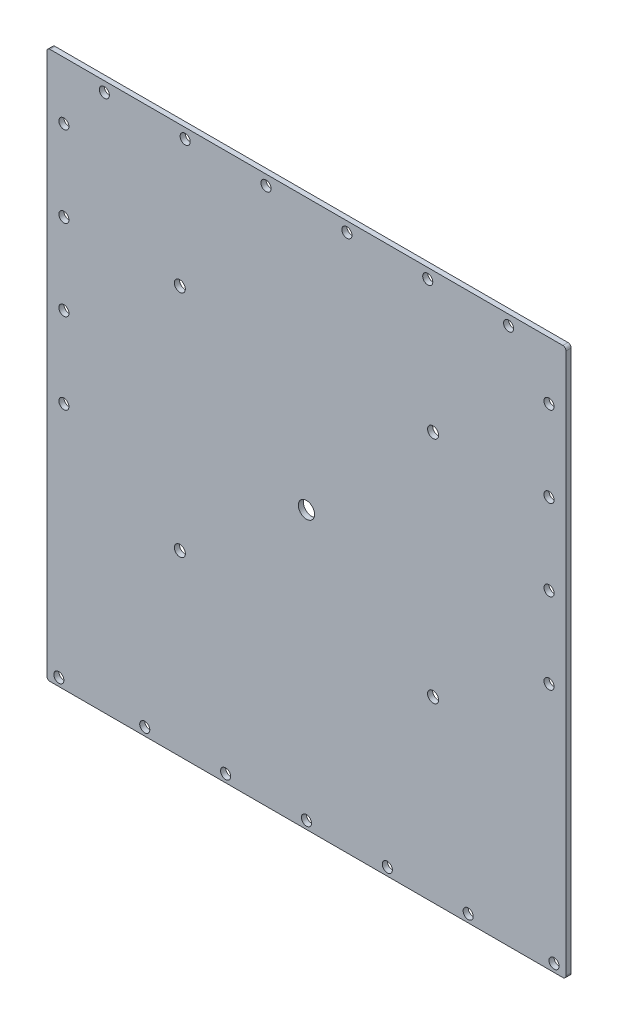
ISO-10303-21;
HEADER;
FILE_DESCRIPTION(('STEP AP214'),'2;1');
FILE_NAME('part.step','',(''),(''),'','','');
FILE_SCHEMA(('AUTOMOTIVE_DESIGN { 1 0 10303 214 1 1 1 1 }'));
ENDSEC;
DATA;
#1=APPLICATION_CONTEXT('core data for automotive mechanical design processes');
#2=APPLICATION_PROTOCOL_DEFINITION('international standard','automotive_design',2000,#1);
#3=PRODUCT_CONTEXT('',#1,'mechanical');
#4=PRODUCT('Part','Part','',(#3));
#5=PRODUCT_RELATED_PRODUCT_CATEGORY('part','',(#4));
#6=PRODUCT_DEFINITION_FORMATION('','',#4);
#7=PRODUCT_DEFINITION_CONTEXT('part definition',#1,'design');
#8=PRODUCT_DEFINITION('design','',#6,#7);
#9=PRODUCT_DEFINITION_SHAPE('','',#8);
#10=(LENGTH_UNIT() NAMED_UNIT(*) SI_UNIT(.MILLI.,.METRE.));
#11=(NAMED_UNIT(*) PLANE_ANGLE_UNIT() SI_UNIT($,.RADIAN.));
#12=(NAMED_UNIT(*) SI_UNIT($,.STERADIAN.) SOLID_ANGLE_UNIT());
#13=UNCERTAINTY_MEASURE_WITH_UNIT(LENGTH_MEASURE(1.E-05),#10,'distance_accuracy_value','');
#14=(GEOMETRIC_REPRESENTATION_CONTEXT(3) GLOBAL_UNCERTAINTY_ASSIGNED_CONTEXT((#13)) GLOBAL_UNIT_ASSIGNED_CONTEXT((#10,
#11,#12)) REPRESENTATION_CONTEXT('',''));
#15=CARTESIAN_POINT('',(0.,0.,0.));
#16=DIRECTION('',(0.,0.,1.));
#17=DIRECTION('',(1.,0.,0.));
#18=AXIS2_PLACEMENT_3D('',#15,#16,#17);
#19=CARTESIAN_POINT('',(0.,-171.98,1.6));
#20=DIRECTION('',(0.,1.,0.));
#21=DIRECTION('',(-1.,0.,0.));
#22=AXIS2_PLACEMENT_3D('',#19,#20,#21);
#23=PLANE('',#22);
#24=DIRECTION('',(1.,0.,0.));
#25=VECTOR('',#24,1.);
#26=CARTESIAN_POINT('',(0.,-171.98,1.6));
#27=LINE('',#26,#25);
#28=CARTESIAN_POINT('',(2.00000000000002,-171.98,1.6));
#29=VERTEX_POINT('',#28);
#30=CARTESIAN_POINT('',(163.1,-171.98,1.6));
#31=VERTEX_POINT('',#30);
#32=EDGE_CURVE('E132',#29,#31,#27,.T.);
#33=ORIENTED_EDGE('',*,*,#32,.F.);
#34=DIRECTION('',(0.,0.,-1.));
#35=VECTOR('',#34,1.);
#36=CARTESIAN_POINT('',(2.00000000000002,-171.98,1.6));
#37=LINE('',#36,#35);
#38=CARTESIAN_POINT('',(2.00000000000002,-171.98,0.));
#39=VERTEX_POINT('',#38);
#40=EDGE_CURVE('E116',#29,#39,#37,.T.);
#41=ORIENTED_EDGE('',*,*,#40,.T.);
#42=DIRECTION('',(1.,0.,0.));
#43=VECTOR('',#42,1.);
#44=CARTESIAN_POINT('',(0.,-171.98,0.));
#45=LINE('',#44,#43);
#46=CARTESIAN_POINT('',(163.1,-171.98,0.));
#47=VERTEX_POINT('',#46);
#48=EDGE_CURVE('E129',#39,#47,#45,.T.);
#49=ORIENTED_EDGE('',*,*,#48,.T.);
#50=DIRECTION('',(0.,0.,-1.));
#51=VECTOR('',#50,1.);
#52=CARTESIAN_POINT('',(163.1,-171.98,1.6));
#53=LINE('',#52,#51);
#54=EDGE_CURVE('E135',#47,#31,#53,.F.);
#55=ORIENTED_EDGE('',*,*,#54,.T.);
#56=EDGE_LOOP('',(#33,#41,#49,#55));
#57=FACE_BOUND('',#56,.T.);
#58=ADVANCED_FACE('F45',(#57),#23,.F.);
#59=CARTESIAN_POINT('',(164.1,0.,1.6));
#60=DIRECTION('',(-1.,0.,0.));
#61=DIRECTION('',(0.,0.,1.));
#62=AXIS2_PLACEMENT_3D('',#59,#60,#61);
#63=PLANE('',#62);
#64=DIRECTION('',(0.,1.,0.));
#65=VECTOR('',#64,1.);
#66=CARTESIAN_POINT('',(164.1,0.,0.));
#67=LINE('',#66,#65);
#68=CARTESIAN_POINT('',(164.1,-170.98,0.));
#69=VERTEX_POINT('',#68);
#70=CARTESIAN_POINT('',(164.1,-0.99999999999998,0.));
#71=VERTEX_POINT('',#70);
#72=EDGE_CURVE('E141',#69,#71,#67,.T.);
#73=ORIENTED_EDGE('',*,*,#72,.T.);
#74=DIRECTION('',(0.,0.,-1.));
#75=VECTOR('',#74,1.);
#76=CARTESIAN_POINT('',(164.1,-0.99999999999998,1.6));
#77=LINE('',#76,#75);
#78=CARTESIAN_POINT('',(164.1,-0.99999999999998,1.6));
#79=VERTEX_POINT('',#78);
#80=EDGE_CURVE('E11',#71,#79,#77,.F.);
#81=ORIENTED_EDGE('',*,*,#80,.T.);
#82=DIRECTION('',(0.,1.,0.));
#83=VECTOR('',#82,1.);
#84=CARTESIAN_POINT('',(164.1,0.,1.6));
#85=LINE('',#84,#83);
#86=CARTESIAN_POINT('',(164.1,-170.98,1.6));
#87=VERTEX_POINT('',#86);
#88=EDGE_CURVE('E283',#87,#79,#85,.T.);
#89=ORIENTED_EDGE('',*,*,#88,.F.);
#90=DIRECTION('',(0.,0.,-1.));
#91=VECTOR('',#90,1.);
#92=CARTESIAN_POINT('',(164.1,-170.98,1.6));
#93=LINE('',#92,#91);
#94=EDGE_CURVE('E54',#87,#69,#93,.T.);
#95=ORIENTED_EDGE('',*,*,#94,.T.);
#96=EDGE_LOOP('',(#73,#81,#89,#95));
#97=FACE_BOUND('',#96,.T.);
#98=ADVANCED_FACE('F281',(#97),#63,.F.);
#99=CARTESIAN_POINT('',(0.,0.,1.6));
#100=DIRECTION('',(0.,1.,0.));
#101=DIRECTION('',(-1.,0.,0.));
#102=AXIS2_PLACEMENT_3D('',#99,#100,#101);
#103=PLANE('',#102);
#104=DIRECTION('',(1.,0.,0.));
#105=VECTOR('',#104,1.);
#106=CARTESIAN_POINT('',(0.,0.,0.));
#107=LINE('',#106,#105);
#108=CARTESIAN_POINT('',(2.,0.,0.));
#109=VERTEX_POINT('',#108);
#110=CARTESIAN_POINT('',(163.1,0.,0.));
#111=VERTEX_POINT('',#110);
#112=EDGE_CURVE('E147',#109,#111,#107,.T.);
#113=ORIENTED_EDGE('',*,*,#112,.F.);
#114=DIRECTION('',(0.,0.,-1.));
#115=VECTOR('',#114,1.);
#116=CARTESIAN_POINT('',(2.,0.,1.6));
#117=LINE('',#116,#115);
#118=CARTESIAN_POINT('',(2.,0.,1.6));
#119=VERTEX_POINT('',#118);
#120=EDGE_CURVE('E68',#109,#119,#117,.F.);
#121=ORIENTED_EDGE('',*,*,#120,.T.);
#122=DIRECTION('',(1.,0.,0.));
#123=VECTOR('',#122,1.);
#124=CARTESIAN_POINT('',(0.,0.,1.6));
#125=LINE('',#124,#123);
#126=CARTESIAN_POINT('',(163.1,0.,1.6));
#127=VERTEX_POINT('',#126);
#128=EDGE_CURVE('E290',#119,#127,#125,.T.);
#129=ORIENTED_EDGE('',*,*,#128,.T.);
#130=DIRECTION('',(0.,0.,-1.));
#131=VECTOR('',#130,1.);
#132=CARTESIAN_POINT('',(163.1,0.,0.));
#133=LINE('',#132,#131);
#134=EDGE_CURVE('E271',#127,#111,#133,.T.);
#135=ORIENTED_EDGE('',*,*,#134,.T.);
#136=EDGE_LOOP('',(#113,#121,#129,#135));
#137=FACE_BOUND('',#136,.T.);
#138=ADVANCED_FACE('F289',(#137),#103,.T.);
#139=CARTESIAN_POINT('',(158.75,-68.85,1.6));
#140=DIRECTION('',(0.,0.,-1.));
#141=DIRECTION('',(-1.,0.,0.));
#142=AXIS2_PLACEMENT_3D('',#139,#140,#141);
#143=CYLINDRICAL_SURFACE('',#142,1.58749999999999);
#144=CARTESIAN_POINT('',(158.75,-68.85,1.6));
#145=DIRECTION('',(0.,0.,1.));
#146=DIRECTION('',(1.,0.,0.));
#147=AXIS2_PLACEMENT_3D('',#144,#145,#146);
#148=CIRCLE('',#147,1.58749999999999);
#149=CARTESIAN_POINT('',(160.3375,-68.85,1.6));
#150=VERTEX_POINT('',#149);
#151=EDGE_CURVE('E378',#150,#150,#148,.F.);
#152=ORIENTED_EDGE('',*,*,#151,.F.);
#153=EDGE_LOOP('',(#152));
#154=FACE_BOUND('',#153,.T.);
#155=CARTESIAN_POINT('',(158.75,-68.85,0.));
#156=DIRECTION('',(0.,0.,1.));
#157=DIRECTION('',(1.,0.,0.));
#158=AXIS2_PLACEMENT_3D('',#155,#156,#157);
#159=CIRCLE('',#158,1.58749999999999);
#160=CARTESIAN_POINT('',(160.3375,-68.85,0.));
#161=VERTEX_POINT('',#160);
#162=EDGE_CURVE('E236',#161,#161,#159,.F.);
#163=ORIENTED_EDGE('',*,*,#162,.T.);
#164=EDGE_LOOP('',(#163));
#165=FACE_BOUND('',#164,.T.);
#166=ADVANCED_FACE('F580',(#154,#165),#143,.F.);
#167=CARTESIAN_POINT('',(120.65,-3.17499999999999,1.6));
#168=DIRECTION('',(0.,0.,-1.));
#169=DIRECTION('',(-1.,0.,0.));
#170=AXIS2_PLACEMENT_3D('',#167,#168,#169);
#171=CYLINDRICAL_SURFACE('',#170,1.5875);
#172=CARTESIAN_POINT('',(120.65,-3.17499999999999,1.6));
#173=DIRECTION('',(0.,0.,1.));
#174=DIRECTION('',(1.,0.,0.));
#175=AXIS2_PLACEMENT_3D('',#172,#173,#174);
#176=CIRCLE('',#175,1.5875);
#177=CARTESIAN_POINT('',(122.2375,-3.17499999999999,1.6));
#178=VERTEX_POINT('',#177);
#179=EDGE_CURVE('E374',#178,#178,#176,.F.);
#180=ORIENTED_EDGE('',*,*,#179,.F.);
#181=EDGE_LOOP('',(#180));
#182=FACE_BOUND('',#181,.T.);
#183=CARTESIAN_POINT('',(120.65,-3.17499999999999,0.));
#184=DIRECTION('',(0.,0.,1.));
#185=DIRECTION('',(1.,0.,0.));
#186=AXIS2_PLACEMENT_3D('',#183,#184,#185);
#187=CIRCLE('',#186,1.5875);
#188=CARTESIAN_POINT('',(122.2375,-3.17499999999999,0.));
#189=VERTEX_POINT('',#188);
#190=EDGE_CURVE('E232',#189,#189,#187,.F.);
#191=ORIENTED_EDGE('',*,*,#190,.T.);
#192=EDGE_LOOP('',(#191));
#193=FACE_BOUND('',#192,.T.);
#194=ADVANCED_FACE('F801',(#182,#193),#171,.F.);
#195=CARTESIAN_POINT('',(160.3375,-169.48,1.6));
#196=DIRECTION('',(0.,0.,-1.));
#197=DIRECTION('',(-1.,0.,0.));
#198=AXIS2_PLACEMENT_3D('',#195,#196,#197);
#199=CYLINDRICAL_SURFACE('',#198,1.58749999999999);
#200=CARTESIAN_POINT('',(160.3375,-169.48,1.6));
#201=DIRECTION('',(0.,0.,1.));
#202=DIRECTION('',(1.,0.,0.));
#203=AXIS2_PLACEMENT_3D('',#200,#201,#202);
#204=CIRCLE('',#203,1.58749999999999);
#205=CARTESIAN_POINT('',(161.925,-169.48,1.6));
#206=VERTEX_POINT('',#205);
#207=EDGE_CURVE('E370',#206,#206,#204,.T.);
#208=ORIENTED_EDGE('',*,*,#207,.T.);
#209=EDGE_LOOP('',(#208));
#210=FACE_BOUND('',#209,.T.);
#211=CARTESIAN_POINT('',(160.3375,-169.48,0.));
#212=DIRECTION('',(0.,0.,1.));
#213=DIRECTION('',(1.,0.,0.));
#214=AXIS2_PLACEMENT_3D('',#211,#212,#213);
#215=CIRCLE('',#214,1.58749999999999);
#216=CARTESIAN_POINT('',(161.925,-169.48,0.));
#217=VERTEX_POINT('',#216);
#218=EDGE_CURVE('E228',#217,#217,#215,.T.);
#219=ORIENTED_EDGE('',*,*,#218,.F.);
#220=EDGE_LOOP('',(#219));
#221=FACE_BOUND('',#220,.T.);
#222=ADVANCED_FACE('F790',(#210,#221),#199,.F.);
#223=CARTESIAN_POINT('',(133.35,-169.48,1.6));
#224=DIRECTION('',(0.,0.,-1.));
#225=DIRECTION('',(-1.,0.,0.));
#226=AXIS2_PLACEMENT_3D('',#223,#224,#225);
#227=CYLINDRICAL_SURFACE('',#226,1.58749999999999);
#228=CARTESIAN_POINT('',(133.35,-169.48,1.6));
#229=DIRECTION('',(0.,0.,1.));
#230=DIRECTION('',(1.,0.,0.));
#231=AXIS2_PLACEMENT_3D('',#228,#229,#230);
#232=CIRCLE('',#231,1.58749999999999);
#233=CARTESIAN_POINT('',(134.9375,-169.48,1.6));
#234=VERTEX_POINT('',#233);
#235=EDGE_CURVE('E366',#234,#234,#232,.T.);
#236=ORIENTED_EDGE('',*,*,#235,.T.);
#237=EDGE_LOOP('',(#236));
#238=FACE_BOUND('',#237,.T.);
#239=CARTESIAN_POINT('',(133.35,-169.48,0.));
#240=DIRECTION('',(0.,0.,1.));
#241=DIRECTION('',(1.,0.,0.));
#242=AXIS2_PLACEMENT_3D('',#239,#240,#241);
#243=CIRCLE('',#242,1.58749999999999);
#244=CARTESIAN_POINT('',(134.9375,-169.48,0.));
#245=VERTEX_POINT('',#244);
#246=EDGE_CURVE('E224',#245,#245,#243,.T.);
#247=ORIENTED_EDGE('',*,*,#246,.F.);
#248=EDGE_LOOP('',(#247));
#249=FACE_BOUND('',#248,.T.);
#250=ADVANCED_FACE('F779',(#238,#249),#227,.F.);
#251=CARTESIAN_POINT('',(107.95,-169.48,1.6));
#252=DIRECTION('',(0.,0.,-1.));
#253=DIRECTION('',(-1.,0.,0.));
#254=AXIS2_PLACEMENT_3D('',#251,#252,#253);
#255=CYLINDRICAL_SURFACE('',#254,1.58749999999999);
#256=CARTESIAN_POINT('',(107.95,-169.48,1.6));
#257=DIRECTION('',(0.,0.,1.));
#258=DIRECTION('',(1.,0.,0.));
#259=AXIS2_PLACEMENT_3D('',#256,#257,#258);
#260=CIRCLE('',#259,1.58749999999999);
#261=CARTESIAN_POINT('',(109.5375,-169.48,1.6));
#262=VERTEX_POINT('',#261);
#263=EDGE_CURVE('E362',#262,#262,#260,.T.);
#264=ORIENTED_EDGE('',*,*,#263,.T.);
#265=EDGE_LOOP('',(#264));
#266=FACE_BOUND('',#265,.T.);
#267=CARTESIAN_POINT('',(107.95,-169.48,0.));
#268=DIRECTION('',(0.,0.,1.));
#269=DIRECTION('',(1.,0.,0.));
#270=AXIS2_PLACEMENT_3D('',#267,#268,#269);
#271=CIRCLE('',#270,1.58749999999999);
#272=CARTESIAN_POINT('',(109.5375,-169.48,0.));
#273=VERTEX_POINT('',#272);
#274=EDGE_CURVE('E220',#273,#273,#271,.T.);
#275=ORIENTED_EDGE('',*,*,#274,.F.);
#276=EDGE_LOOP('',(#275));
#277=FACE_BOUND('',#276,.T.);
#278=ADVANCED_FACE('F768',(#266,#277),#255,.F.);
#279=CARTESIAN_POINT('',(95.25,-3.175,1.6));
#280=DIRECTION('',(0.,0.,-1.));
#281=DIRECTION('',(-1.,0.,0.));
#282=AXIS2_PLACEMENT_3D('',#279,#280,#281);
#283=CYLINDRICAL_SURFACE('',#282,1.5875);
#284=CARTESIAN_POINT('',(95.25,-3.175,1.6));
#285=DIRECTION('',(0.,0.,1.));
#286=DIRECTION('',(1.,0.,0.));
#287=AXIS2_PLACEMENT_3D('',#284,#285,#286);
#288=CIRCLE('',#287,1.5875);
#289=CARTESIAN_POINT('',(96.8375,-3.175,1.6));
#290=VERTEX_POINT('',#289);
#291=EDGE_CURVE('E358',#290,#290,#288,.F.);
#292=ORIENTED_EDGE('',*,*,#291,.F.);
#293=EDGE_LOOP('',(#292));
#294=FACE_BOUND('',#293,.T.);
#295=CARTESIAN_POINT('',(95.25,-3.175,0.));
#296=DIRECTION('',(0.,0.,1.));
#297=DIRECTION('',(1.,0.,0.));
#298=AXIS2_PLACEMENT_3D('',#295,#296,#297);
#299=CIRCLE('',#298,1.5875);
#300=CARTESIAN_POINT('',(96.8375,-3.175,0.));
#301=VERTEX_POINT('',#300);
#302=EDGE_CURVE('E216',#301,#301,#299,.F.);
#303=ORIENTED_EDGE('',*,*,#302,.T.);
#304=EDGE_LOOP('',(#303));
#305=FACE_BOUND('',#304,.T.);
#306=ADVANCED_FACE('F757',(#294,#305),#283,.F.);
#307=CARTESIAN_POINT('',(146.05,-3.17499999999998,1.6));
#308=DIRECTION('',(0.,0.,-1.));
#309=DIRECTION('',(-1.,0.,0.));
#310=AXIS2_PLACEMENT_3D('',#307,#308,#309);
#311=CYLINDRICAL_SURFACE('',#310,1.58749999999999);
#312=CARTESIAN_POINT('',(146.05,-3.17499999999998,1.6));
#313=DIRECTION('',(0.,0.,1.));
#314=DIRECTION('',(1.,0.,0.));
#315=AXIS2_PLACEMENT_3D('',#312,#313,#314);
#316=CIRCLE('',#315,1.58749999999999);
#317=CARTESIAN_POINT('',(147.6375,-3.17499999999998,1.6));
#318=VERTEX_POINT('',#317);
#319=EDGE_CURVE('E354',#318,#318,#316,.F.);
#320=ORIENTED_EDGE('',*,*,#319,.F.);
#321=EDGE_LOOP('',(#320));
#322=FACE_BOUND('',#321,.T.);
#323=CARTESIAN_POINT('',(146.05,-3.17499999999998,0.));
#324=DIRECTION('',(0.,0.,1.));
#325=DIRECTION('',(1.,0.,0.));
#326=AXIS2_PLACEMENT_3D('',#323,#324,#325);
#327=CIRCLE('',#326,1.58749999999999);
#328=CARTESIAN_POINT('',(147.6375,-3.17499999999998,0.));
#329=VERTEX_POINT('',#328);
#330=EDGE_CURVE('E212',#329,#329,#327,.F.);
#331=ORIENTED_EDGE('',*,*,#330,.T.);
#332=EDGE_LOOP('',(#331));
#333=FACE_BOUND('',#332,.T.);
#334=ADVANCED_FACE('F746',(#322,#333),#311,.F.);
#335=CARTESIAN_POINT('',(158.75,-94.25,1.6));
#336=DIRECTION('',(0.,0.,-1.));
#337=DIRECTION('',(-1.,0.,0.));
#338=AXIS2_PLACEMENT_3D('',#335,#336,#337);
#339=CYLINDRICAL_SURFACE('',#338,1.58749999999999);
#340=CARTESIAN_POINT('',(158.75,-94.25,1.6));
#341=DIRECTION('',(0.,0.,1.));
#342=DIRECTION('',(1.,0.,0.));
#343=AXIS2_PLACEMENT_3D('',#340,#341,#342);
#344=CIRCLE('',#343,1.58749999999999);
#345=CARTESIAN_POINT('',(160.3375,-94.25,1.6));
#346=VERTEX_POINT('',#345);
#347=EDGE_CURVE('E350',#346,#346,#344,.F.);
#348=ORIENTED_EDGE('',*,*,#347,.F.);
#349=EDGE_LOOP('',(#348));
#350=FACE_BOUND('',#349,.T.);
#351=CARTESIAN_POINT('',(158.75,-94.25,0.));
#352=DIRECTION('',(0.,0.,1.));
#353=DIRECTION('',(1.,0.,0.));
#354=AXIS2_PLACEMENT_3D('',#351,#352,#353);
#355=CIRCLE('',#354,1.58749999999999);
#356=CARTESIAN_POINT('',(160.3375,-94.25,0.));
#357=VERTEX_POINT('',#356);
#358=EDGE_CURVE('E208',#357,#357,#355,.F.);
#359=ORIENTED_EDGE('',*,*,#358,.T.);
#360=EDGE_LOOP('',(#359));
#361=FACE_BOUND('',#360,.T.);
#362=ADVANCED_FACE('F735',(#350,#361),#339,.F.);
#363=CARTESIAN_POINT('',(158.750000000001,-18.05,1.6));
#364=DIRECTION('',(0.,0.,-1.));
#365=DIRECTION('',(-1.,0.,0.));
#366=AXIS2_PLACEMENT_3D('',#363,#364,#365);
#367=CYLINDRICAL_SURFACE('',#366,1.58749999999999);
#368=CARTESIAN_POINT('',(158.750000000001,-18.05,1.6));
#369=DIRECTION('',(0.,0.,1.));
#370=DIRECTION('',(1.,0.,0.));
#371=AXIS2_PLACEMENT_3D('',#368,#369,#370);
#372=CIRCLE('',#371,1.58749999999999);
#373=CARTESIAN_POINT('',(160.3375,-18.05,1.6));
#374=VERTEX_POINT('',#373);
#375=EDGE_CURVE('E346',#374,#374,#372,.F.);
#376=ORIENTED_EDGE('',*,*,#375,.F.);
#377=EDGE_LOOP('',(#376));
#378=FACE_BOUND('',#377,.T.);
#379=CARTESIAN_POINT('',(158.750000000001,-18.05,0.));
#380=DIRECTION('',(0.,0.,1.));
#381=DIRECTION('',(1.,0.,0.));
#382=AXIS2_PLACEMENT_3D('',#379,#380,#381);
#383=CIRCLE('',#382,1.58749999999999);
#384=CARTESIAN_POINT('',(160.3375,-18.05,0.));
#385=VERTEX_POINT('',#384);
#386=EDGE_CURVE('E204',#385,#385,#383,.F.);
#387=ORIENTED_EDGE('',*,*,#386,.T.);
#388=EDGE_LOOP('',(#387));
#389=FACE_BOUND('',#388,.T.);
#390=ADVANCED_FACE('F724',(#378,#389),#367,.F.);
#391=CARTESIAN_POINT('',(69.85,-3.175,1.6));
#392=DIRECTION('',(0.,0.,-1.));
#393=DIRECTION('',(-1.,0.,0.));
#394=AXIS2_PLACEMENT_3D('',#391,#392,#393);
#395=CYLINDRICAL_SURFACE('',#394,1.5875);
#396=CARTESIAN_POINT('',(69.85,-3.175,1.6));
#397=DIRECTION('',(0.,0.,1.));
#398=DIRECTION('',(1.,0.,0.));
#399=AXIS2_PLACEMENT_3D('',#396,#397,#398);
#400=CIRCLE('',#399,1.5875);
#401=CARTESIAN_POINT('',(71.4375,-3.175,1.6));
#402=VERTEX_POINT('',#401);
#403=EDGE_CURVE('E342',#402,#402,#400,.T.);
#404=ORIENTED_EDGE('',*,*,#403,.T.);
#405=EDGE_LOOP('',(#404));
#406=FACE_BOUND('',#405,.T.);
#407=CARTESIAN_POINT('',(69.85,-3.175,0.));
#408=DIRECTION('',(0.,0.,1.));
#409=DIRECTION('',(1.,0.,0.));
#410=AXIS2_PLACEMENT_3D('',#407,#408,#409);
#411=CIRCLE('',#410,1.5875);
#412=CARTESIAN_POINT('',(71.4375,-3.175,0.));
#413=VERTEX_POINT('',#412);
#414=EDGE_CURVE('E200',#413,#413,#411,.T.);
#415=ORIENTED_EDGE('',*,*,#414,.F.);
#416=EDGE_LOOP('',(#415));
#417=FACE_BOUND('',#416,.T.);
#418=ADVANCED_FACE('F713',(#406,#417),#395,.F.);
#419=CARTESIAN_POINT('',(44.45,-3.175,1.6));
#420=DIRECTION('',(0.,0.,-1.));
#421=DIRECTION('',(-1.,0.,0.));
#422=AXIS2_PLACEMENT_3D('',#419,#420,#421);
#423=CYLINDRICAL_SURFACE('',#422,1.5875);
#424=CARTESIAN_POINT('',(44.45,-3.175,1.6));
#425=DIRECTION('',(0.,0.,1.));
#426=DIRECTION('',(1.,0.,0.));
#427=AXIS2_PLACEMENT_3D('',#424,#425,#426);
#428=CIRCLE('',#427,1.5875);
#429=CARTESIAN_POINT('',(46.0375,-3.175,1.6));
#430=VERTEX_POINT('',#429);
#431=EDGE_CURVE('E338',#430,#430,#428,.T.);
#432=ORIENTED_EDGE('',*,*,#431,.T.);
#433=EDGE_LOOP('',(#432));
#434=FACE_BOUND('',#433,.T.);
#435=CARTESIAN_POINT('',(44.45,-3.175,0.));
#436=DIRECTION('',(0.,0.,1.));
#437=DIRECTION('',(1.,0.,0.));
#438=AXIS2_PLACEMENT_3D('',#435,#436,#437);
#439=CIRCLE('',#438,1.5875);
#440=CARTESIAN_POINT('',(46.0375,-3.175,0.));
#441=VERTEX_POINT('',#440);
#442=EDGE_CURVE('E196',#441,#441,#439,.T.);
#443=ORIENTED_EDGE('',*,*,#442,.F.);
#444=EDGE_LOOP('',(#443));
#445=FACE_BOUND('',#444,.T.);
#446=ADVANCED_FACE('F702',(#434,#445),#423,.F.);
#447=CARTESIAN_POINT('',(19.05,-3.175,1.6));
#448=DIRECTION('',(0.,0.,-1.));
#449=DIRECTION('',(-1.,0.,0.));
#450=AXIS2_PLACEMENT_3D('',#447,#448,#449);
#451=CYLINDRICAL_SURFACE('',#450,1.5875);
#452=CARTESIAN_POINT('',(19.05,-3.175,1.6));
#453=DIRECTION('',(0.,0.,1.));
#454=DIRECTION('',(1.,0.,0.));
#455=AXIS2_PLACEMENT_3D('',#452,#453,#454);
#456=CIRCLE('',#455,1.5875);
#457=CARTESIAN_POINT('',(20.6375,-3.175,1.6));
#458=VERTEX_POINT('',#457);
#459=EDGE_CURVE('E334',#458,#458,#456,.T.);
#460=ORIENTED_EDGE('',*,*,#459,.T.);
#461=EDGE_LOOP('',(#460));
#462=FACE_BOUND('',#461,.T.);
#463=CARTESIAN_POINT('',(19.05,-3.175,0.));
#464=DIRECTION('',(0.,0.,1.));
#465=DIRECTION('',(1.,0.,0.));
#466=AXIS2_PLACEMENT_3D('',#463,#464,#465);
#467=CIRCLE('',#466,1.5875);
#468=CARTESIAN_POINT('',(20.6375,-3.175,0.));
#469=VERTEX_POINT('',#468);
#470=EDGE_CURVE('E192',#469,#469,#467,.T.);
#471=ORIENTED_EDGE('',*,*,#470,.F.);
#472=EDGE_LOOP('',(#471));
#473=FACE_BOUND('',#472,.T.);
#474=ADVANCED_FACE('F691',(#462,#473),#451,.F.);
#475=CARTESIAN_POINT('',(31.75,-169.48,1.6));
#476=DIRECTION('',(0.,0.,-1.));
#477=DIRECTION('',(-1.,0.,0.));
#478=AXIS2_PLACEMENT_3D('',#475,#476,#477);
#479=CYLINDRICAL_SURFACE('',#478,1.5875);
#480=CARTESIAN_POINT('',(31.75,-169.48,1.6));
#481=DIRECTION('',(0.,0.,1.));
#482=DIRECTION('',(1.,0.,0.));
#483=AXIS2_PLACEMENT_3D('',#480,#481,#482);
#484=CIRCLE('',#483,1.5875);
#485=CARTESIAN_POINT('',(33.3375,-169.48,1.6));
#486=VERTEX_POINT('',#485);
#487=EDGE_CURVE('E330',#486,#486,#484,.T.);
#488=ORIENTED_EDGE('',*,*,#487,.T.);
#489=EDGE_LOOP('',(#488));
#490=FACE_BOUND('',#489,.T.);
#491=CARTESIAN_POINT('',(31.75,-169.48,0.));
#492=DIRECTION('',(0.,0.,1.));
#493=DIRECTION('',(1.,0.,0.));
#494=AXIS2_PLACEMENT_3D('',#491,#492,#493);
#495=CIRCLE('',#494,1.5875);
#496=CARTESIAN_POINT('',(33.3375,-169.48,0.));
#497=VERTEX_POINT('',#496);
#498=EDGE_CURVE('E188',#497,#497,#495,.T.);
#499=ORIENTED_EDGE('',*,*,#498,.F.);
#500=EDGE_LOOP('',(#499));
#501=FACE_BOUND('',#500,.T.);
#502=ADVANCED_FACE('F680',(#490,#501),#479,.F.);
#503=CARTESIAN_POINT('',(57.15,-169.48,1.6));
#504=DIRECTION('',(0.,0.,-1.));
#505=DIRECTION('',(-1.,0.,0.));
#506=AXIS2_PLACEMENT_3D('',#503,#504,#505);
#507=CYLINDRICAL_SURFACE('',#506,1.5875);
#508=CARTESIAN_POINT('',(57.15,-169.48,1.6));
#509=DIRECTION('',(0.,0.,1.));
#510=DIRECTION('',(1.,0.,0.));
#511=AXIS2_PLACEMENT_3D('',#508,#509,#510);
#512=CIRCLE('',#511,1.5875);
#513=CARTESIAN_POINT('',(58.7375,-169.48,1.6));
#514=VERTEX_POINT('',#513);
#515=EDGE_CURVE('E326',#514,#514,#512,.T.);
#516=ORIENTED_EDGE('',*,*,#515,.T.);
#517=EDGE_LOOP('',(#516));
#518=FACE_BOUND('',#517,.T.);
#519=CARTESIAN_POINT('',(57.15,-169.48,0.));
#520=DIRECTION('',(0.,0.,1.));
#521=DIRECTION('',(1.,0.,0.));
#522=AXIS2_PLACEMENT_3D('',#519,#520,#521);
#523=CIRCLE('',#522,1.5875);
#524=CARTESIAN_POINT('',(58.7375,-169.48,0.));
#525=VERTEX_POINT('',#524);
#526=EDGE_CURVE('E184',#525,#525,#523,.T.);
#527=ORIENTED_EDGE('',*,*,#526,.F.);
#528=EDGE_LOOP('',(#527));
#529=FACE_BOUND('',#528,.T.);
#530=ADVANCED_FACE('F669',(#518,#529),#507,.F.);
#531=CARTESIAN_POINT('',(6.34999999999949,-18.05,1.6));
#532=DIRECTION('',(0.,0.,-1.));
#533=DIRECTION('',(-1.,0.,0.));
#534=AXIS2_PLACEMENT_3D('',#531,#532,#533);
#535=CYLINDRICAL_SURFACE('',#534,1.5875);
#536=CARTESIAN_POINT('',(6.34999999999949,-18.05,1.6));
#537=DIRECTION('',(0.,0.,1.));
#538=DIRECTION('',(1.,0.,0.));
#539=AXIS2_PLACEMENT_3D('',#536,#537,#538);
#540=CIRCLE('',#539,1.5875);
#541=CARTESIAN_POINT('',(7.93749999999949,-18.05,1.6));
#542=VERTEX_POINT('',#541);
#543=EDGE_CURVE('E322',#542,#542,#540,.T.);
#544=ORIENTED_EDGE('',*,*,#543,.T.);
#545=EDGE_LOOP('',(#544));
#546=FACE_BOUND('',#545,.T.);
#547=CARTESIAN_POINT('',(6.34999999999949,-18.05,0.));
#548=DIRECTION('',(0.,0.,1.));
#549=DIRECTION('',(1.,0.,0.));
#550=AXIS2_PLACEMENT_3D('',#547,#548,#549);
#551=CIRCLE('',#550,1.5875);
#552=CARTESIAN_POINT('',(7.93749999999949,-18.05,0.));
#553=VERTEX_POINT('',#552);
#554=EDGE_CURVE('E180',#553,#553,#551,.T.);
#555=ORIENTED_EDGE('',*,*,#554,.F.);
#556=EDGE_LOOP('',(#555));
#557=FACE_BOUND('',#556,.T.);
#558=ADVANCED_FACE('F658',(#546,#557),#535,.F.);
#559=CARTESIAN_POINT('',(4.7625,-169.48,1.6));
#560=DIRECTION('',(0.,0.,-1.));
#561=DIRECTION('',(-1.,0.,0.));
#562=AXIS2_PLACEMENT_3D('',#559,#560,#561);
#563=CYLINDRICAL_SURFACE('',#562,1.5875);
#564=CARTESIAN_POINT('',(4.7625,-169.48,1.6));
#565=DIRECTION('',(0.,0.,1.));
#566=DIRECTION('',(1.,0.,0.));
#567=AXIS2_PLACEMENT_3D('',#564,#565,#566);
#568=CIRCLE('',#567,1.5875);
#569=CARTESIAN_POINT('',(6.35,-169.48,1.6));
#570=VERTEX_POINT('',#569);
#571=EDGE_CURVE('E318',#570,#570,#568,.F.);
#572=ORIENTED_EDGE('',*,*,#571,.F.);
#573=EDGE_LOOP('',(#572));
#574=FACE_BOUND('',#573,.T.);
#575=CARTESIAN_POINT('',(4.7625,-169.48,0.));
#576=DIRECTION('',(0.,0.,1.));
#577=DIRECTION('',(1.,0.,0.));
#578=AXIS2_PLACEMENT_3D('',#575,#576,#577);
#579=CIRCLE('',#578,1.5875);
#580=CARTESIAN_POINT('',(6.35,-169.48,0.));
#581=VERTEX_POINT('',#580);
#582=EDGE_CURVE('E176',#581,#581,#579,.F.);
#583=ORIENTED_EDGE('',*,*,#582,.T.);
#584=EDGE_LOOP('',(#583));
#585=FACE_BOUND('',#584,.T.);
#586=ADVANCED_FACE('F647',(#574,#585),#563,.F.);
#587=CARTESIAN_POINT('',(6.34999999999976,-43.45,1.6));
#588=DIRECTION('',(0.,0.,-1.));
#589=DIRECTION('',(-1.,0.,0.));
#590=AXIS2_PLACEMENT_3D('',#587,#588,#589);
#591=CYLINDRICAL_SURFACE('',#590,1.5875);
#592=CARTESIAN_POINT('',(6.34999999999976,-43.45,1.6));
#593=DIRECTION('',(0.,0.,1.));
#594=DIRECTION('',(1.,0.,0.));
#595=AXIS2_PLACEMENT_3D('',#592,#593,#594);
#596=CIRCLE('',#595,1.5875);
#597=CARTESIAN_POINT('',(7.93749999999976,-43.45,1.6));
#598=VERTEX_POINT('',#597);
#599=EDGE_CURVE('E314',#598,#598,#596,.T.);
#600=ORIENTED_EDGE('',*,*,#599,.T.);
#601=EDGE_LOOP('',(#600));
#602=FACE_BOUND('',#601,.T.);
#603=CARTESIAN_POINT('',(6.34999999999976,-43.45,0.));
#604=DIRECTION('',(0.,0.,1.));
#605=DIRECTION('',(1.,0.,0.));
#606=AXIS2_PLACEMENT_3D('',#603,#604,#605);
#607=CIRCLE('',#606,1.5875);
#608=CARTESIAN_POINT('',(7.93749999999976,-43.45,0.));
#609=VERTEX_POINT('',#608);
#610=EDGE_CURVE('E172',#609,#609,#607,.T.);
#611=ORIENTED_EDGE('',*,*,#610,.F.);
#612=EDGE_LOOP('',(#611));
#613=FACE_BOUND('',#612,.T.);
#614=ADVANCED_FACE('F636',(#602,#613),#591,.F.);
#615=CARTESIAN_POINT('',(6.35000000000002,-68.85,1.6));
#616=DIRECTION('',(0.,0.,-1.));
#617=DIRECTION('',(-1.,0.,0.));
#618=AXIS2_PLACEMENT_3D('',#615,#616,#617);
#619=CYLINDRICAL_SURFACE('',#618,1.5875);
#620=CARTESIAN_POINT('',(6.35000000000002,-68.85,1.6));
#621=DIRECTION('',(0.,0.,1.));
#622=DIRECTION('',(1.,0.,0.));
#623=AXIS2_PLACEMENT_3D('',#620,#621,#622);
#624=CIRCLE('',#623,1.5875);
#625=CARTESIAN_POINT('',(7.93750000000002,-68.85,1.6));
#626=VERTEX_POINT('',#625);
#627=EDGE_CURVE('E310',#626,#626,#624,.T.);
#628=ORIENTED_EDGE('',*,*,#627,.T.);
#629=EDGE_LOOP('',(#628));
#630=FACE_BOUND('',#629,.T.);
#631=CARTESIAN_POINT('',(6.35000000000002,-68.85,0.));
#632=DIRECTION('',(0.,0.,1.));
#633=DIRECTION('',(1.,0.,0.));
#634=AXIS2_PLACEMENT_3D('',#631,#632,#633);
#635=CIRCLE('',#634,1.5875);
#636=CARTESIAN_POINT('',(7.93750000000002,-68.85,0.));
#637=VERTEX_POINT('',#636);
#638=EDGE_CURVE('E168',#637,#637,#635,.T.);
#639=ORIENTED_EDGE('',*,*,#638,.F.);
#640=EDGE_LOOP('',(#639));
#641=FACE_BOUND('',#640,.T.);
#642=ADVANCED_FACE('F625',(#630,#641),#619,.F.);
#643=CARTESIAN_POINT('',(6.35000000000029,-94.25,1.6));
#644=DIRECTION('',(0.,0.,-1.));
#645=DIRECTION('',(-1.,0.,0.));
#646=AXIS2_PLACEMENT_3D('',#643,#644,#645);
#647=CYLINDRICAL_SURFACE('',#646,1.5875);
#648=CARTESIAN_POINT('',(6.35000000000029,-94.25,1.6));
#649=DIRECTION('',(0.,0.,1.));
#650=DIRECTION('',(1.,0.,0.));
#651=AXIS2_PLACEMENT_3D('',#648,#649,#650);
#652=CIRCLE('',#651,1.5875);
#653=CARTESIAN_POINT('',(7.93750000000029,-94.25,1.6));
#654=VERTEX_POINT('',#653);
#655=EDGE_CURVE('E306',#654,#654,#652,.T.);
#656=ORIENTED_EDGE('',*,*,#655,.T.);
#657=EDGE_LOOP('',(#656));
#658=FACE_BOUND('',#657,.T.);
#659=CARTESIAN_POINT('',(6.35000000000029,-94.25,0.));
#660=DIRECTION('',(0.,0.,1.));
#661=DIRECTION('',(1.,0.,0.));
#662=AXIS2_PLACEMENT_3D('',#659,#660,#661);
#663=CIRCLE('',#662,1.5875);
#664=CARTESIAN_POINT('',(7.93750000000029,-94.25,0.));
#665=VERTEX_POINT('',#664);
#666=EDGE_CURVE('E164',#665,#665,#663,.T.);
#667=ORIENTED_EDGE('',*,*,#666,.F.);
#668=EDGE_LOOP('',(#667));
#669=FACE_BOUND('',#668,.T.);
#670=ADVANCED_FACE('F614',(#658,#669),#647,.F.);
#671=CARTESIAN_POINT('',(82.55,-169.48,1.6));
#672=DIRECTION('',(0.,0.,-1.));
#673=DIRECTION('',(-1.,0.,0.));
#674=AXIS2_PLACEMENT_3D('',#671,#672,#673);
#675=CYLINDRICAL_SURFACE('',#674,1.5875);
#676=CARTESIAN_POINT('',(82.55,-169.48,1.6));
#677=DIRECTION('',(0.,0.,1.));
#678=DIRECTION('',(1.,0.,0.));
#679=AXIS2_PLACEMENT_3D('',#676,#677,#678);
#680=CIRCLE('',#679,1.5875);
#681=CARTESIAN_POINT('',(84.1375,-169.48,1.6));
#682=VERTEX_POINT('',#681);
#683=EDGE_CURVE('E298',#682,#682,#680,.T.);
#684=ORIENTED_EDGE('',*,*,#683,.T.);
#685=EDGE_LOOP('',(#684));
#686=FACE_BOUND('',#685,.T.);
#687=CARTESIAN_POINT('',(82.55,-169.48,0.));
#688=DIRECTION('',(0.,0.,1.));
#689=DIRECTION('',(1.,0.,0.));
#690=AXIS2_PLACEMENT_3D('',#687,#688,#689);
#691=CIRCLE('',#690,1.5875);
#692=CARTESIAN_POINT('',(84.1375,-169.48,0.));
#693=VERTEX_POINT('',#692);
#694=EDGE_CURVE('E160',#693,#693,#691,.T.);
#695=ORIENTED_EDGE('',*,*,#694,.F.);
#696=EDGE_LOOP('',(#695));
#697=FACE_BOUND('',#696,.T.);
#698=ADVANCED_FACE('F566',(#686,#697),#675,.F.);
#699=CARTESIAN_POINT('',(1.,0.,1.6));
#700=DIRECTION('',(1.,0.,0.));
#701=DIRECTION('',(0.,1.,0.));
#702=AXIS2_PLACEMENT_3D('',#699,#700,#701);
#703=PLANE('',#702);
#704=DIRECTION('',(0.,-1.,0.));
#705=VECTOR('',#704,1.);
#706=CARTESIAN_POINT('',(1.,0.,0.));
#707=LINE('',#706,#705);
#708=CARTESIAN_POINT('',(1.,-1.,0.));
#709=VERTEX_POINT('',#708);
#710=CARTESIAN_POINT('',(1.00000000000002,-170.98,0.));
#711=VERTEX_POINT('',#710);
#712=EDGE_CURVE('E157',#709,#711,#707,.T.);
#713=ORIENTED_EDGE('',*,*,#712,.T.);
#714=DIRECTION('',(0.,0.,-1.));
#715=VECTOR('',#714,1.);
#716=CARTESIAN_POINT('',(1.00000000000002,-170.98,1.6));
#717=LINE('',#716,#715);
#718=CARTESIAN_POINT('',(1.00000000000002,-170.98,1.6));
#719=VERTEX_POINT('',#718);
#720=EDGE_CURVE('E117',#711,#719,#717,.F.);
#721=ORIENTED_EDGE('',*,*,#720,.T.);
#722=DIRECTION('',(0.,-1.,0.));
#723=VECTOR('',#722,1.);
#724=CARTESIAN_POINT('',(1.,0.,1.6));
#725=LINE('',#724,#723);
#726=CARTESIAN_POINT('',(1.,-1.,1.6));
#727=VERTEX_POINT('',#726);
#728=EDGE_CURVE('E293',#727,#719,#725,.T.);
#729=ORIENTED_EDGE('',*,*,#728,.F.);
#730=DIRECTION('',(0.,0.,-1.));
#731=VECTOR('',#730,1.);
#732=CARTESIAN_POINT('',(1.,-1.,0.));
#733=LINE('',#732,#731);
#734=EDGE_CURVE('E123',#727,#709,#733,.T.);
#735=ORIENTED_EDGE('',*,*,#734,.T.);
#736=EDGE_LOOP('',(#713,#721,#729,#735));
#737=FACE_BOUND('',#736,.T.);
#738=ADVANCED_FACE('F416',(#737),#703,.F.);
#739=CARTESIAN_POINT('',(82.55,-85.,1.6));
#740=DIRECTION('',(0.,0.,-1.));
#741=DIRECTION('',(-1.,0.,0.));
#742=AXIS2_PLACEMENT_3D('',#739,#740,#741);
#743=CYLINDRICAL_SURFACE('',#742,2.55270000000003);
#744=CARTESIAN_POINT('',(82.55,-85.,1.6));
#745=DIRECTION('',(0.,0.,1.));
#746=DIRECTION('',(1.,0.,0.));
#747=AXIS2_PLACEMENT_3D('',#744,#745,#746);
#748=CIRCLE('',#747,2.55270000000003);
#749=CARTESIAN_POINT('',(85.1027,-85.,1.6));
#750=VERTEX_POINT('',#749);
#751=EDGE_CURVE('E244',#750,#750,#748,.T.);
#752=ORIENTED_EDGE('',*,*,#751,.T.);
#753=EDGE_LOOP('',(#752));
#754=FACE_BOUND('',#753,.T.);
#755=CARTESIAN_POINT('',(82.55,-85.,0.));
#756=DIRECTION('',(0.,0.,1.));
#757=DIRECTION('',(1.,0.,0.));
#758=AXIS2_PLACEMENT_3D('',#755,#756,#757);
#759=CIRCLE('',#758,2.55270000000003);
#760=CARTESIAN_POINT('',(85.1027,-85.,0.));
#761=VERTEX_POINT('',#760);
#762=EDGE_CURVE('E142',#761,#761,#759,.T.);
#763=ORIENTED_EDGE('',*,*,#762,.F.);
#764=EDGE_LOOP('',(#763));
#765=FACE_BOUND('',#764,.T.);
#766=ADVANCED_FACE('F390',(#754,#765),#743,.F.);
#767=CARTESIAN_POINT('',(158.75,-43.45,1.6));
#768=DIRECTION('',(0.,0.,-1.));
#769=DIRECTION('',(-1.,0.,0.));
#770=AXIS2_PLACEMENT_3D('',#767,#768,#769);
#771=CYLINDRICAL_SURFACE('',#770,1.58749999999999);
#772=CARTESIAN_POINT('',(158.75,-43.45,1.6));
#773=DIRECTION('',(0.,0.,1.));
#774=DIRECTION('',(1.,0.,0.));
#775=AXIS2_PLACEMENT_3D('',#772,#773,#774);
#776=CIRCLE('',#775,1.58749999999999);
#777=CARTESIAN_POINT('',(160.3375,-43.45,1.6));
#778=VERTEX_POINT('',#777);
#779=EDGE_CURVE('E246',#778,#778,#776,.F.);
#780=ORIENTED_EDGE('',*,*,#779,.F.);
#781=EDGE_LOOP('',(#780));
#782=FACE_BOUND('',#781,.T.);
#783=CARTESIAN_POINT('',(158.75,-43.45,0.));
#784=DIRECTION('',(0.,0.,1.));
#785=DIRECTION('',(1.,0.,0.));
#786=AXIS2_PLACEMENT_3D('',#783,#784,#785);
#787=CIRCLE('',#786,1.58749999999999);
#788=CARTESIAN_POINT('',(160.3375,-43.45,0.));
#789=VERTEX_POINT('',#788);
#790=EDGE_CURVE('E240',#789,#789,#787,.F.);
#791=ORIENTED_EDGE('',*,*,#790,.T.);
#792=EDGE_LOOP('',(#791));
#793=FACE_BOUND('',#792,.T.);
#794=ADVANCED_FACE('F387',(#782,#793),#771,.F.);
#795=CARTESIAN_POINT('',(0.,0.,1.6));
#796=DIRECTION('',(0.,0.,1.));
#797=DIRECTION('',(1.,0.,0.));
#798=AXIS2_PLACEMENT_3D('',#795,#796,#797);
#799=PLANE('',#798);
#800=CARTESIAN_POINT('',(42.775,-43.995,1.6));
#801=DIRECTION('',(0.,0.,1.));
#802=DIRECTION('',(1.,0.,0.));
#803=AXIS2_PLACEMENT_3D('',#800,#801,#802);
#804=CIRCLE('',#803,1.725);
#805=CARTESIAN_POINT('',(44.5,-43.995,1.6));
#806=VERTEX_POINT('',#805);
#807=EDGE_CURVE('E150',#806,#806,#804,.T.);
#808=ORIENTED_EDGE('',*,*,#807,.F.);
#809=EDGE_LOOP('',(#808));
#810=FACE_BOUND('',#809,.T.);
#811=CARTESIAN_POINT('',(122.325,-115.985,1.6));
#812=DIRECTION('',(0.,0.,1.));
#813=DIRECTION('',(1.,0.,0.));
#814=AXIS2_PLACEMENT_3D('',#811,#812,#813);
#815=CIRCLE('',#814,1.72499999999998);
#816=CARTESIAN_POINT('',(124.05,-115.985,1.6));
#817=VERTEX_POINT('',#816);
#818=EDGE_CURVE('E441',#817,#817,#815,.T.);
#819=ORIENTED_EDGE('',*,*,#818,.F.);
#820=EDGE_LOOP('',(#819));
#821=FACE_BOUND('',#820,.T.);
#822=CARTESIAN_POINT('',(42.775,-115.985,1.6));
#823=DIRECTION('',(0.,0.,1.));
#824=DIRECTION('',(1.,0.,0.));
#825=AXIS2_PLACEMENT_3D('',#822,#823,#824);
#826=CIRCLE('',#825,1.72499999999998);
#827=CARTESIAN_POINT('',(44.5,-115.985,1.6));
#828=VERTEX_POINT('',#827);
#829=EDGE_CURVE('E445',#828,#828,#826,.T.);
#830=ORIENTED_EDGE('',*,*,#829,.F.);
#831=EDGE_LOOP('',(#830));
#832=FACE_BOUND('',#831,.T.);
#833=CARTESIAN_POINT('',(122.325,-43.995,1.6));
#834=DIRECTION('',(0.,0.,1.));
#835=DIRECTION('',(1.,0.,0.));
#836=AXIS2_PLACEMENT_3D('',#833,#834,#835);
#837=CIRCLE('',#836,1.725);
#838=CARTESIAN_POINT('',(124.05,-43.995,1.6));
#839=VERTEX_POINT('',#838);
#840=EDGE_CURVE('E449',#839,#839,#837,.T.);
#841=ORIENTED_EDGE('',*,*,#840,.F.);
#842=EDGE_LOOP('',(#841));
#843=FACE_BOUND('',#842,.T.);
#844=ORIENTED_EDGE('',*,*,#751,.F.);
#845=EDGE_LOOP('',(#844));
#846=FACE_BOUND('',#845,.T.);
#847=ORIENTED_EDGE('',*,*,#728,.T.);
#848=CARTESIAN_POINT('',(2.00000000000002,-170.98,1.6));
#849=DIRECTION('',(0.,0.,1.));
#850=DIRECTION('',(1.,0.,0.));
#851=AXIS2_PLACEMENT_3D('',#848,#849,#850);
#852=CIRCLE('',#851,1.);
#853=EDGE_CURVE('E268',#719,#29,#852,.T.);
#854=ORIENTED_EDGE('',*,*,#853,.T.);
#855=ORIENTED_EDGE('',*,*,#32,.T.);
#856=CARTESIAN_POINT('',(163.1,-170.98,1.6));
#857=DIRECTION('',(0.,0.,1.));
#858=DIRECTION('',(1.,0.,0.));
#859=AXIS2_PLACEMENT_3D('',#856,#857,#858);
#860=CIRCLE('',#859,1.);
#861=EDGE_CURVE('E260',#31,#87,#860,.T.);
#862=ORIENTED_EDGE('',*,*,#861,.T.);
#863=ORIENTED_EDGE('',*,*,#88,.T.);
#864=CARTESIAN_POINT('',(163.1,-0.99999999999998,1.6));
#865=DIRECTION('',(0.,0.,1.));
#866=DIRECTION('',(1.,0.,0.));
#867=AXIS2_PLACEMENT_3D('',#864,#865,#866);
#868=CIRCLE('',#867,1.);
#869=EDGE_CURVE('E61',#79,#127,#868,.T.);
#870=ORIENTED_EDGE('',*,*,#869,.T.);
#871=ORIENTED_EDGE('',*,*,#128,.F.);
#872=CARTESIAN_POINT('',(2.,-1.,1.6));
#873=DIRECTION('',(0.,0.,1.));
#874=DIRECTION('',(1.,0.,0.));
#875=AXIS2_PLACEMENT_3D('',#872,#873,#874);
#876=CIRCLE('',#875,1.);
#877=EDGE_CURVE('E265',#119,#727,#876,.T.);
#878=ORIENTED_EDGE('',*,*,#877,.T.);
#879=EDGE_LOOP('',(#847,#854,#855,#862,#863,#870,#871,#878));
#880=FACE_BOUND('',#879,.T.);
#881=ORIENTED_EDGE('',*,*,#683,.F.);
#882=EDGE_LOOP('',(#881));
#883=FACE_BOUND('',#882,.T.);
#884=ORIENTED_EDGE('',*,*,#655,.F.);
#885=EDGE_LOOP('',(#884));
#886=FACE_BOUND('',#885,.T.);
#887=ORIENTED_EDGE('',*,*,#627,.F.);
#888=EDGE_LOOP('',(#887));
#889=FACE_BOUND('',#888,.T.);
#890=ORIENTED_EDGE('',*,*,#599,.F.);
#891=EDGE_LOOP('',(#890));
#892=FACE_BOUND('',#891,.T.);
#893=ORIENTED_EDGE('',*,*,#571,.T.);
#894=EDGE_LOOP('',(#893));
#895=FACE_BOUND('',#894,.T.);
#896=ORIENTED_EDGE('',*,*,#543,.F.);
#897=EDGE_LOOP('',(#896));
#898=FACE_BOUND('',#897,.T.);
#899=ORIENTED_EDGE('',*,*,#515,.F.);
#900=EDGE_LOOP('',(#899));
#901=FACE_BOUND('',#900,.T.);
#902=ORIENTED_EDGE('',*,*,#487,.F.);
#903=EDGE_LOOP('',(#902));
#904=FACE_BOUND('',#903,.T.);
#905=ORIENTED_EDGE('',*,*,#459,.F.);
#906=EDGE_LOOP('',(#905));
#907=FACE_BOUND('',#906,.T.);
#908=ORIENTED_EDGE('',*,*,#431,.F.);
#909=EDGE_LOOP('',(#908));
#910=FACE_BOUND('',#909,.T.);
#911=ORIENTED_EDGE('',*,*,#403,.F.);
#912=EDGE_LOOP('',(#911));
#913=FACE_BOUND('',#912,.T.);
#914=ORIENTED_EDGE('',*,*,#375,.T.);
#915=EDGE_LOOP('',(#914));
#916=FACE_BOUND('',#915,.T.);
#917=ORIENTED_EDGE('',*,*,#347,.T.);
#918=EDGE_LOOP('',(#917));
#919=FACE_BOUND('',#918,.T.);
#920=ORIENTED_EDGE('',*,*,#319,.T.);
#921=EDGE_LOOP('',(#920));
#922=FACE_BOUND('',#921,.T.);
#923=ORIENTED_EDGE('',*,*,#291,.T.);
#924=EDGE_LOOP('',(#923));
#925=FACE_BOUND('',#924,.T.);
#926=ORIENTED_EDGE('',*,*,#263,.F.);
#927=EDGE_LOOP('',(#926));
#928=FACE_BOUND('',#927,.T.);
#929=ORIENTED_EDGE('',*,*,#235,.F.);
#930=EDGE_LOOP('',(#929));
#931=FACE_BOUND('',#930,.T.);
#932=ORIENTED_EDGE('',*,*,#207,.F.);
#933=EDGE_LOOP('',(#932));
#934=FACE_BOUND('',#933,.T.);
#935=ORIENTED_EDGE('',*,*,#179,.T.);
#936=EDGE_LOOP('',(#935));
#937=FACE_BOUND('',#936,.T.);
#938=ORIENTED_EDGE('',*,*,#151,.T.);
#939=EDGE_LOOP('',(#938));
#940=FACE_BOUND('',#939,.T.);
#941=ORIENTED_EDGE('',*,*,#779,.T.);
#942=EDGE_LOOP('',(#941));
#943=FACE_BOUND('',#942,.T.);
#944=ADVANCED_FACE('F385',(#810,#821,#832,#843,#846,#880,#883,#886,#889,#892,#895,#898,#901,
#904,#907,#910,#913,#916,#919,#922,#925,#928,#931,#934,#937,#940,#943),#799,.T.);
#945=CARTESIAN_POINT('',(0.,0.,0.));
#946=DIRECTION('',(0.,0.,1.));
#947=DIRECTION('',(1.,0.,0.));
#948=AXIS2_PLACEMENT_3D('',#945,#946,#947);
#949=PLANE('',#948);
#950=CARTESIAN_POINT('',(42.775,-43.995,0.));
#951=DIRECTION('',(0.,0.,1.));
#952=DIRECTION('',(1.,0.,0.));
#953=AXIS2_PLACEMENT_3D('',#950,#951,#952);
#954=CIRCLE('',#953,1.725);
#955=CARTESIAN_POINT('',(44.5,-43.995,0.));
#956=VERTEX_POINT('',#955);
#957=EDGE_CURVE('E457',#956,#956,#954,.T.);
#958=ORIENTED_EDGE('',*,*,#957,.T.);
#959=EDGE_LOOP('',(#958));
#960=FACE_BOUND('',#959,.T.);
#961=CARTESIAN_POINT('',(122.325,-115.985,0.));
#962=DIRECTION('',(0.,0.,1.));
#963=DIRECTION('',(1.,0.,0.));
#964=AXIS2_PLACEMENT_3D('',#961,#962,#963);
#965=CIRCLE('',#964,1.72499999999998);
#966=CARTESIAN_POINT('',(124.05,-115.985,0.));
#967=VERTEX_POINT('',#966);
#968=EDGE_CURVE('E458',#967,#967,#965,.T.);
#969=ORIENTED_EDGE('',*,*,#968,.T.);
#970=EDGE_LOOP('',(#969));
#971=FACE_BOUND('',#970,.T.);
#972=CARTESIAN_POINT('',(42.775,-115.985,0.));
#973=DIRECTION('',(0.,0.,1.));
#974=DIRECTION('',(1.,0.,0.));
#975=AXIS2_PLACEMENT_3D('',#972,#973,#974);
#976=CIRCLE('',#975,1.72499999999998);
#977=CARTESIAN_POINT('',(44.5,-115.985,0.));
#978=VERTEX_POINT('',#977);
#979=EDGE_CURVE('E462',#978,#978,#976,.T.);
#980=ORIENTED_EDGE('',*,*,#979,.T.);
#981=EDGE_LOOP('',(#980));
#982=FACE_BOUND('',#981,.T.);
#983=CARTESIAN_POINT('',(122.325,-43.995,0.));
#984=DIRECTION('',(0.,0.,1.));
#985=DIRECTION('',(1.,0.,0.));
#986=AXIS2_PLACEMENT_3D('',#983,#984,#985);
#987=CIRCLE('',#986,1.725);
#988=CARTESIAN_POINT('',(124.05,-43.995,0.));
#989=VERTEX_POINT('',#988);
#990=EDGE_CURVE('E453',#989,#989,#987,.T.);
#991=ORIENTED_EDGE('',*,*,#990,.T.);
#992=EDGE_LOOP('',(#991));
#993=FACE_BOUND('',#992,.T.);
#994=ORIENTED_EDGE('',*,*,#762,.T.);
#995=EDGE_LOOP('',(#994));
#996=FACE_BOUND('',#995,.T.);
#997=ORIENTED_EDGE('',*,*,#48,.F.);
#998=CARTESIAN_POINT('',(2.00000000000002,-170.98,0.));
#999=DIRECTION('',(0.,0.,1.));
#1000=DIRECTION('',(1.,0.,0.));
#1001=AXIS2_PLACEMENT_3D('',#998,#999,#1000);
#1002=CIRCLE('',#1001,1.);
#1003=EDGE_CURVE('E112',#39,#711,#1002,.F.);
#1004=ORIENTED_EDGE('',*,*,#1003,.T.);
#1005=ORIENTED_EDGE('',*,*,#712,.F.);
#1006=CARTESIAN_POINT('',(2.,-1.,0.));
#1007=DIRECTION('',(0.,0.,1.));
#1008=DIRECTION('',(1.,0.,0.));
#1009=AXIS2_PLACEMENT_3D('',#1006,#1007,#1008);
#1010=CIRCLE('',#1009,1.);
#1011=EDGE_CURVE('E124',#709,#109,#1010,.F.);
#1012=ORIENTED_EDGE('',*,*,#1011,.T.);
#1013=ORIENTED_EDGE('',*,*,#112,.T.);
#1014=CARTESIAN_POINT('',(163.1,-0.99999999999998,0.));
#1015=DIRECTION('',(0.,0.,1.));
#1016=DIRECTION('',(1.,0.,0.));
#1017=AXIS2_PLACEMENT_3D('',#1014,#1015,#1016);
#1018=CIRCLE('',#1017,1.);
#1019=EDGE_CURVE('E250',#111,#71,#1018,.F.);
#1020=ORIENTED_EDGE('',*,*,#1019,.T.);
#1021=ORIENTED_EDGE('',*,*,#72,.F.);
#1022=CARTESIAN_POINT('',(163.1,-170.98,0.));
#1023=DIRECTION('',(0.,0.,1.));
#1024=DIRECTION('',(1.,0.,0.));
#1025=AXIS2_PLACEMENT_3D('',#1022,#1023,#1024);
#1026=CIRCLE('',#1025,1.);
#1027=EDGE_CURVE('E134',#69,#47,#1026,.F.);
#1028=ORIENTED_EDGE('',*,*,#1027,.T.);
#1029=EDGE_LOOP('',(#997,#1004,#1005,#1012,#1013,#1020,#1021,#1028));
#1030=FACE_BOUND('',#1029,.T.);
#1031=ORIENTED_EDGE('',*,*,#694,.T.);
#1032=EDGE_LOOP('',(#1031));
#1033=FACE_BOUND('',#1032,.T.);
#1034=ORIENTED_EDGE('',*,*,#666,.T.);
#1035=EDGE_LOOP('',(#1034));
#1036=FACE_BOUND('',#1035,.T.);
#1037=ORIENTED_EDGE('',*,*,#638,.T.);
#1038=EDGE_LOOP('',(#1037));
#1039=FACE_BOUND('',#1038,.T.);
#1040=ORIENTED_EDGE('',*,*,#610,.T.);
#1041=EDGE_LOOP('',(#1040));
#1042=FACE_BOUND('',#1041,.T.);
#1043=ORIENTED_EDGE('',*,*,#582,.F.);
#1044=EDGE_LOOP('',(#1043));
#1045=FACE_BOUND('',#1044,.T.);
#1046=ORIENTED_EDGE('',*,*,#554,.T.);
#1047=EDGE_LOOP('',(#1046));
#1048=FACE_BOUND('',#1047,.T.);
#1049=ORIENTED_EDGE('',*,*,#526,.T.);
#1050=EDGE_LOOP('',(#1049));
#1051=FACE_BOUND('',#1050,.T.);
#1052=ORIENTED_EDGE('',*,*,#498,.T.);
#1053=EDGE_LOOP('',(#1052));
#1054=FACE_BOUND('',#1053,.T.);
#1055=ORIENTED_EDGE('',*,*,#470,.T.);
#1056=EDGE_LOOP('',(#1055));
#1057=FACE_BOUND('',#1056,.T.);
#1058=ORIENTED_EDGE('',*,*,#442,.T.);
#1059=EDGE_LOOP('',(#1058));
#1060=FACE_BOUND('',#1059,.T.);
#1061=ORIENTED_EDGE('',*,*,#414,.T.);
#1062=EDGE_LOOP('',(#1061));
#1063=FACE_BOUND('',#1062,.T.);
#1064=ORIENTED_EDGE('',*,*,#386,.F.);
#1065=EDGE_LOOP('',(#1064));
#1066=FACE_BOUND('',#1065,.T.);
#1067=ORIENTED_EDGE('',*,*,#358,.F.);
#1068=EDGE_LOOP('',(#1067));
#1069=FACE_BOUND('',#1068,.T.);
#1070=ORIENTED_EDGE('',*,*,#330,.F.);
#1071=EDGE_LOOP('',(#1070));
#1072=FACE_BOUND('',#1071,.T.);
#1073=ORIENTED_EDGE('',*,*,#302,.F.);
#1074=EDGE_LOOP('',(#1073));
#1075=FACE_BOUND('',#1074,.T.);
#1076=ORIENTED_EDGE('',*,*,#274,.T.);
#1077=EDGE_LOOP('',(#1076));
#1078=FACE_BOUND('',#1077,.T.);
#1079=ORIENTED_EDGE('',*,*,#246,.T.);
#1080=EDGE_LOOP('',(#1079));
#1081=FACE_BOUND('',#1080,.T.);
#1082=ORIENTED_EDGE('',*,*,#218,.T.);
#1083=EDGE_LOOP('',(#1082));
#1084=FACE_BOUND('',#1083,.T.);
#1085=ORIENTED_EDGE('',*,*,#190,.F.);
#1086=EDGE_LOOP('',(#1085));
#1087=FACE_BOUND('',#1086,.T.);
#1088=ORIENTED_EDGE('',*,*,#162,.F.);
#1089=EDGE_LOOP('',(#1088));
#1090=FACE_BOUND('',#1089,.T.);
#1091=ORIENTED_EDGE('',*,*,#790,.F.);
#1092=EDGE_LOOP('',(#1091));
#1093=FACE_BOUND('',#1092,.T.);
#1094=ADVANCED_FACE('F137',(#960,#971,#982,#993,#996,#1030,#1033,#1036,#1039,#1042,#1045,#1048,
#1051,#1054,#1057,#1060,#1063,#1066,#1069,#1072,#1075,#1078,#1081,#1084,#1087,#1090,#1093),#949,.F.);
#1095=CARTESIAN_POINT('',(2.00000000000002,-170.98,1.6));
#1096=DIRECTION('',(0.,0.,-1.));
#1097=DIRECTION('',(-1.,0.,0.));
#1098=AXIS2_PLACEMENT_3D('',#1095,#1096,#1097);
#1099=CYLINDRICAL_SURFACE('',#1098,1.);
#1100=ORIENTED_EDGE('',*,*,#853,.F.);
#1101=ORIENTED_EDGE('',*,*,#720,.F.);
#1102=ORIENTED_EDGE('',*,*,#1003,.F.);
#1103=ORIENTED_EDGE('',*,*,#40,.F.);
#1104=EDGE_LOOP('',(#1100,#1101,#1102,#1103));
#1105=FACE_BOUND('',#1104,.T.);
#1106=ADVANCED_FACE('F115',(#1105),#1099,.T.);
#1107=CARTESIAN_POINT('',(2.,-1.,1.6));
#1108=DIRECTION('',(0.,0.,1.));
#1109=DIRECTION('',(1.,0.,0.));
#1110=AXIS2_PLACEMENT_3D('',#1107,#1108,#1109);
#1111=CYLINDRICAL_SURFACE('',#1110,1.);
#1112=ORIENTED_EDGE('',*,*,#877,.F.);
#1113=ORIENTED_EDGE('',*,*,#120,.F.);
#1114=ORIENTED_EDGE('',*,*,#1011,.F.);
#1115=ORIENTED_EDGE('',*,*,#734,.F.);
#1116=EDGE_LOOP('',(#1112,#1113,#1114,#1115));
#1117=FACE_BOUND('',#1116,.T.);
#1118=ADVANCED_FACE('F401',(#1117),#1111,.T.);
#1119=CARTESIAN_POINT('',(163.1,-0.99999999999998,1.6));
#1120=DIRECTION('',(0.,0.,1.));
#1121=DIRECTION('',(1.,0.,0.));
#1122=AXIS2_PLACEMENT_3D('',#1119,#1120,#1121);
#1123=CYLINDRICAL_SURFACE('',#1122,1.);
#1124=ORIENTED_EDGE('',*,*,#869,.F.);
#1125=ORIENTED_EDGE('',*,*,#80,.F.);
#1126=ORIENTED_EDGE('',*,*,#1019,.F.);
#1127=ORIENTED_EDGE('',*,*,#134,.F.);
#1128=EDGE_LOOP('',(#1124,#1125,#1126,#1127));
#1129=FACE_BOUND('',#1128,.T.);
#1130=ADVANCED_FACE('F288',(#1129),#1123,.T.);
#1131=CARTESIAN_POINT('',(163.1,-170.98,1.6));
#1132=DIRECTION('',(0.,0.,-1.));
#1133=DIRECTION('',(-1.,0.,0.));
#1134=AXIS2_PLACEMENT_3D('',#1131,#1132,#1133);
#1135=CYLINDRICAL_SURFACE('',#1134,1.);
#1136=ORIENTED_EDGE('',*,*,#861,.F.);
#1137=ORIENTED_EDGE('',*,*,#54,.F.);
#1138=ORIENTED_EDGE('',*,*,#1027,.F.);
#1139=ORIENTED_EDGE('',*,*,#94,.F.);
#1140=EDGE_LOOP('',(#1136,#1137,#1138,#1139));
#1141=FACE_BOUND('',#1140,.T.);
#1142=ADVANCED_FACE('F47',(#1141),#1135,.T.);
#1143=CARTESIAN_POINT('',(122.325,-43.995,0.));
#1144=DIRECTION('',(0.,0.,1.));
#1145=DIRECTION('',(1.,0.,0.));
#1146=AXIS2_PLACEMENT_3D('',#1143,#1144,#1145);
#1147=CYLINDRICAL_SURFACE('',#1146,1.725);
#1148=ORIENTED_EDGE('',*,*,#840,.T.);
#1149=EDGE_LOOP('',(#1148));
#1150=FACE_BOUND('',#1149,.T.);
#1151=ORIENTED_EDGE('',*,*,#990,.F.);
#1152=EDGE_LOOP('',(#1151));
#1153=FACE_BOUND('',#1152,.T.);
#1154=ADVANCED_FACE('F425',(#1150,#1153),#1147,.F.);
#1155=CARTESIAN_POINT('',(42.775,-115.985,0.));
#1156=DIRECTION('',(0.,0.,1.));
#1157=DIRECTION('',(1.,0.,0.));
#1158=AXIS2_PLACEMENT_3D('',#1155,#1156,#1157);
#1159=CYLINDRICAL_SURFACE('',#1158,1.72499999999998);
#1160=ORIENTED_EDGE('',*,*,#829,.T.);
#1161=EDGE_LOOP('',(#1160));
#1162=FACE_BOUND('',#1161,.T.);
#1163=ORIENTED_EDGE('',*,*,#979,.F.);
#1164=EDGE_LOOP('',(#1163));
#1165=FACE_BOUND('',#1164,.T.);
#1166=ADVANCED_FACE('F429',(#1162,#1165),#1159,.F.);
#1167=CARTESIAN_POINT('',(122.325,-115.985,0.));
#1168=DIRECTION('',(0.,0.,1.));
#1169=DIRECTION('',(1.,0.,0.));
#1170=AXIS2_PLACEMENT_3D('',#1167,#1168,#1169);
#1171=CYLINDRICAL_SURFACE('',#1170,1.72499999999998);
#1172=ORIENTED_EDGE('',*,*,#818,.T.);
#1173=EDGE_LOOP('',(#1172));
#1174=FACE_BOUND('',#1173,.T.);
#1175=ORIENTED_EDGE('',*,*,#968,.F.);
#1176=EDGE_LOOP('',(#1175));
#1177=FACE_BOUND('',#1176,.T.);
#1178=ADVANCED_FACE('F472',(#1174,#1177),#1171,.F.);
#1179=CARTESIAN_POINT('',(42.775,-43.995,0.));
#1180=DIRECTION('',(0.,0.,1.));
#1181=DIRECTION('',(1.,0.,0.));
#1182=AXIS2_PLACEMENT_3D('',#1179,#1180,#1181);
#1183=CYLINDRICAL_SURFACE('',#1182,1.725);
#1184=ORIENTED_EDGE('',*,*,#807,.T.);
#1185=EDGE_LOOP('',(#1184));
#1186=FACE_BOUND('',#1185,.T.);
#1187=ORIENTED_EDGE('',*,*,#957,.F.);
#1188=EDGE_LOOP('',(#1187));
#1189=FACE_BOUND('',#1188,.T.);
#1190=ADVANCED_FACE('F478',(#1186,#1189),#1183,.F.);
#1191=CLOSED_SHELL('',(#58,#98,#138,#166,#194,#222,#250,#278,#306,#334,#362,#390,#418,#446,#474,
#502,#530,#558,#586,#614,#642,#670,#698,#738,#766,#794,#944,#1094,#1106,#1118,#1130,#1142,#1154,
#1166,#1178,#1190));
#1192=MANIFOLD_SOLID_BREP('B2',#1191);
#1193=ADVANCED_BREP_SHAPE_REPRESENTATION('',(#18,#1192),#14);
#1194=SHAPE_DEFINITION_REPRESENTATION(#9,#1193);
ENDSEC;
END-ISO-10303-21;
